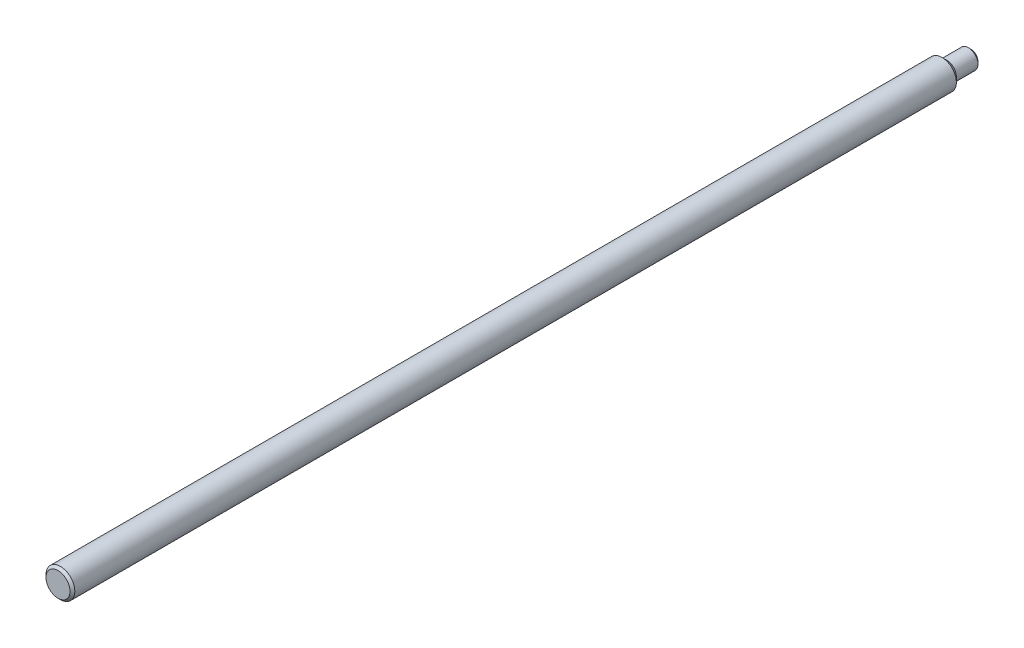
ISO-10303-21;
HEADER;
FILE_DESCRIPTION(('STEP AP214'),'2;1');
FILE_NAME('part.step','',(''),(''),'','','');
FILE_SCHEMA(('AUTOMOTIVE_DESIGN { 1 0 10303 214 1 1 1 1 }'));
ENDSEC;
DATA;
#1=APPLICATION_CONTEXT('core data for automotive mechanical design processes');
#2=APPLICATION_PROTOCOL_DEFINITION('international standard','automotive_design',2000,#1);
#3=PRODUCT_CONTEXT('',#1,'mechanical');
#4=PRODUCT('Part','Part','',(#3));
#5=PRODUCT_RELATED_PRODUCT_CATEGORY('part','',(#4));
#6=PRODUCT_DEFINITION_FORMATION('','',#4);
#7=PRODUCT_DEFINITION_CONTEXT('part definition',#1,'design');
#8=PRODUCT_DEFINITION('design','',#6,#7);
#9=PRODUCT_DEFINITION_SHAPE('','',#8);
#10=(LENGTH_UNIT() NAMED_UNIT(*) SI_UNIT(.MILLI.,.METRE.));
#11=(NAMED_UNIT(*) PLANE_ANGLE_UNIT() SI_UNIT($,.RADIAN.));
#12=(NAMED_UNIT(*) SI_UNIT($,.STERADIAN.) SOLID_ANGLE_UNIT());
#13=UNCERTAINTY_MEASURE_WITH_UNIT(LENGTH_MEASURE(1.E-05),#10,'distance_accuracy_value','');
#14=(GEOMETRIC_REPRESENTATION_CONTEXT(3) GLOBAL_UNCERTAINTY_ASSIGNED_CONTEXT((#13)) GLOBAL_UNIT_ASSIGNED_CONTEXT((#10,
#11,#12)) REPRESENTATION_CONTEXT('',''));
#15=CARTESIAN_POINT('',(0.,0.,0.));
#16=DIRECTION('',(0.,0.,1.));
#17=DIRECTION('',(1.,0.,0.));
#18=AXIS2_PLACEMENT_3D('',#15,#16,#17);
#19=CARTESIAN_POINT('',(0.,0.,380.));
#20=DIRECTION('',(0.,0.,-1.));
#21=DIRECTION('',(-1.,0.,0.));
#22=AXIS2_PLACEMENT_3D('',#19,#20,#21);
#23=CYLINDRICAL_SURFACE('',#22,6.);
#24=CARTESIAN_POINT('',(0.,0.,379.));
#25=DIRECTION('',(0.,0.,1.));
#26=DIRECTION('',(1.,0.,0.));
#27=AXIS2_PLACEMENT_3D('',#24,#25,#26);
#28=CIRCLE('',#27,6.);
#29=CARTESIAN_POINT('',(6.,0.,379.));
#30=VERTEX_POINT('',#29);
#31=EDGE_CURVE('E10',#30,#30,#28,.F.);
#32=ORIENTED_EDGE('',*,*,#31,.T.);
#33=EDGE_LOOP('',(#32));
#34=FACE_BOUND('',#33,.T.);
#35=CARTESIAN_POINT('',(0.,0.,12.));
#36=DIRECTION('',(0.,0.,-1.));
#37=DIRECTION('',(-1.,0.,0.));
#38=AXIS2_PLACEMENT_3D('',#35,#36,#37);
#39=CIRCLE('',#38,6.);
#40=CARTESIAN_POINT('',(-6.,0.,12.));
#41=VERTEX_POINT('',#40);
#42=EDGE_CURVE('E53',#41,#41,#39,.T.);
#43=ORIENTED_EDGE('',*,*,#42,.F.);
#44=EDGE_LOOP('',(#43));
#45=FACE_BOUND('',#44,.T.);
#46=ADVANCED_FACE('F33',(#34,#45),#23,.T.);
#47=CARTESIAN_POINT('',(0.,0.,380.));
#48=DIRECTION('',(0.,0.,1.));
#49=DIRECTION('',(1.,0.,0.));
#50=AXIS2_PLACEMENT_3D('',#47,#48,#49);
#51=PLANE('',#50);
#52=CARTESIAN_POINT('',(0.,0.,380.));
#53=DIRECTION('',(0.,0.,1.));
#54=DIRECTION('',(1.,0.,0.));
#55=AXIS2_PLACEMENT_3D('',#52,#53,#54);
#56=CIRCLE('',#55,5.00000000000006);
#57=CARTESIAN_POINT('',(5.00000000000006,0.,380.));
#58=VERTEX_POINT('',#57);
#59=EDGE_CURVE('E40',#58,#58,#56,.T.);
#60=ORIENTED_EDGE('',*,*,#59,.T.);
#61=EDGE_LOOP('',(#60));
#62=FACE_BOUND('',#61,.T.);
#63=ADVANCED_FACE('F70',(#62),#51,.T.);
#64=CARTESIAN_POINT('',(0.,0.,-1.89872136735725));
#65=DIRECTION('',(0.,0.,-1.));
#66=DIRECTION('',(-1.,0.,0.));
#67=AXIS2_PLACEMENT_3D('',#64,#65,#66);
#68=CYLINDRICAL_SURFACE('',#67,4.);
#69=CARTESIAN_POINT('',(0.,0.,0.999999999999955));
#70=DIRECTION('',(0.,0.,1.));
#71=DIRECTION('',(1.,0.,0.));
#72=AXIS2_PLACEMENT_3D('',#69,#70,#71);
#73=CIRCLE('',#72,4.);
#74=CARTESIAN_POINT('',(4.,0.,0.999999999999955));
#75=VERTEX_POINT('',#74);
#76=EDGE_CURVE('E44',#75,#75,#73,.T.);
#77=ORIENTED_EDGE('',*,*,#76,.T.);
#78=EDGE_LOOP('',(#77));
#79=FACE_BOUND('',#78,.T.);
#80=CARTESIAN_POINT('',(0.,0.,10.));
#81=DIRECTION('',(0.,0.,-1.));
#82=DIRECTION('',(-1.,0.,0.));
#83=AXIS2_PLACEMENT_3D('',#80,#81,#82);
#84=CIRCLE('',#83,4.);
#85=CARTESIAN_POINT('',(-4.,0.,10.));
#86=VERTEX_POINT('',#85);
#87=EDGE_CURVE('E56',#86,#86,#84,.T.);
#88=ORIENTED_EDGE('',*,*,#87,.T.);
#89=EDGE_LOOP('',(#88));
#90=FACE_BOUND('',#89,.T.);
#91=ADVANCED_FACE('F60',(#79,#90),#68,.T.);
#92=CARTESIAN_POINT('',(0.,0.,12.));
#93=DIRECTION('',(0.,0.,1.));
#94=DIRECTION('',(1.,0.,0.));
#95=AXIS2_PLACEMENT_3D('',#92,#93,#94);
#96=CONICAL_SURFACE('',#95,6.,0.78539816339745);
#97=ORIENTED_EDGE('',*,*,#87,.F.);
#98=EDGE_LOOP('',(#97));
#99=FACE_BOUND('',#98,.T.);
#100=ORIENTED_EDGE('',*,*,#42,.T.);
#101=EDGE_LOOP('',(#100));
#102=FACE_BOUND('',#101,.T.);
#103=ADVANCED_FACE('F62',(#99,#102),#96,.T.);
#104=CARTESIAN_POINT('',(0.,0.,0.));
#105=DIRECTION('',(0.,0.,1.));
#106=DIRECTION('',(1.,0.,0.));
#107=AXIS2_PLACEMENT_3D('',#104,#105,#106);
#108=PLANE('',#107);
#109=CARTESIAN_POINT('',(0.,0.,0.));
#110=DIRECTION('',(0.,0.,1.));
#111=DIRECTION('',(1.,0.,0.));
#112=AXIS2_PLACEMENT_3D('',#109,#110,#111);
#113=CIRCLE('',#112,3.00000000000006);
#114=CARTESIAN_POINT('',(3.00000000000006,0.,0.));
#115=VERTEX_POINT('',#114);
#116=EDGE_CURVE('E48',#115,#115,#113,.F.);
#117=ORIENTED_EDGE('',*,*,#116,.T.);
#118=EDGE_LOOP('',(#117));
#119=FACE_BOUND('',#118,.T.);
#120=ADVANCED_FACE('F65',(#119),#108,.F.);
#121=CARTESIAN_POINT('',(0.,0.,0.));
#122=DIRECTION('',(0.,0.,1.));
#123=DIRECTION('',(1.,0.,0.));
#124=AXIS2_PLACEMENT_3D('',#121,#122,#123);
#125=CONICAL_SURFACE('',#124,3.00000000000006,0.785398163397441);
#126=ORIENTED_EDGE('',*,*,#76,.F.);
#127=EDGE_LOOP('',(#126));
#128=FACE_BOUND('',#127,.T.);
#129=ORIENTED_EDGE('',*,*,#116,.F.);
#130=EDGE_LOOP('',(#129));
#131=FACE_BOUND('',#130,.T.);
#132=ADVANCED_FACE('F77',(#128,#131),#125,.T.);
#133=CARTESIAN_POINT('',(0.,0.,380.));
#134=DIRECTION('',(0.,0.,-1.));
#135=DIRECTION('',(-1.,0.,0.));
#136=AXIS2_PLACEMENT_3D('',#133,#134,#135);
#137=CONICAL_SURFACE('',#136,5.00000000000006,0.785398163397473);
#138=ORIENTED_EDGE('',*,*,#31,.F.);
#139=EDGE_LOOP('',(#138));
#140=FACE_BOUND('',#139,.T.);
#141=ORIENTED_EDGE('',*,*,#59,.F.);
#142=EDGE_LOOP('',(#141));
#143=FACE_BOUND('',#142,.T.);
#144=ADVANCED_FACE('F35',(#140,#143),#137,.T.);
#145=CLOSED_SHELL('',(#46,#63,#91,#103,#120,#132,#144));
#146=MANIFOLD_SOLID_BREP('B2',#145);
#147=ADVANCED_BREP_SHAPE_REPRESENTATION('',(#18,#146),#14);
#148=SHAPE_DEFINITION_REPRESENTATION(#9,#147);
ENDSEC;
END-ISO-10303-21;
